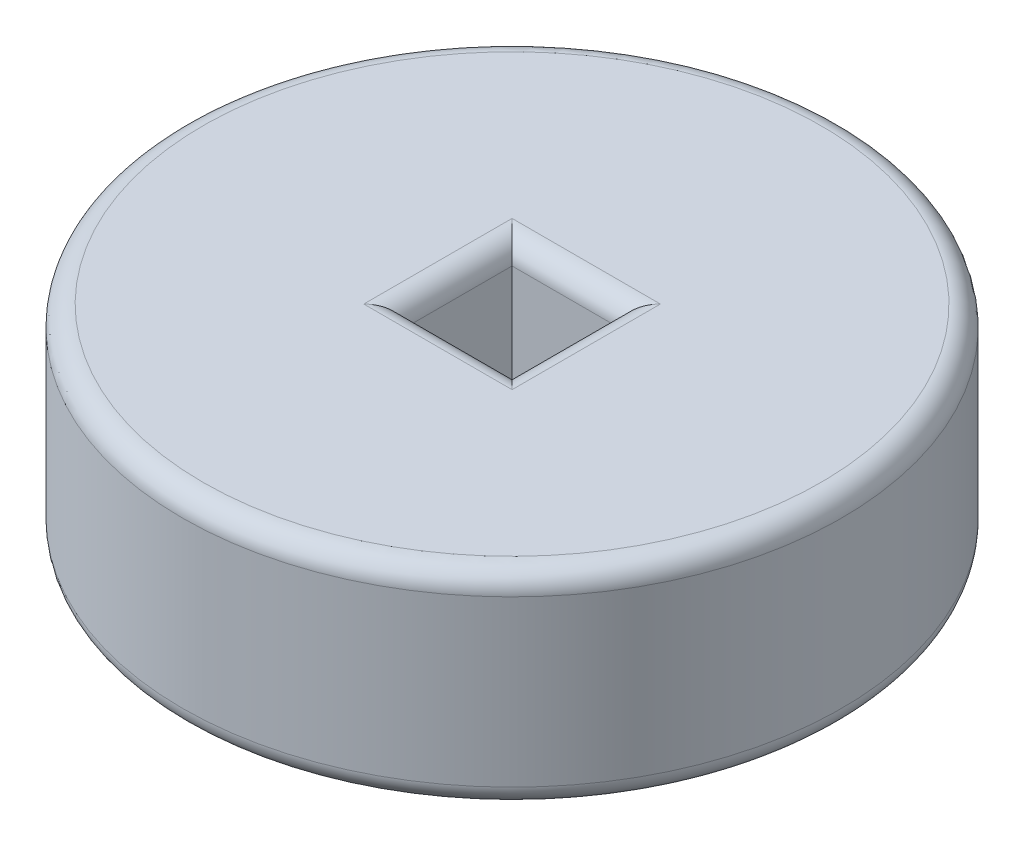
ISO-10303-21;
HEADER;
FILE_DESCRIPTION(('STEP AP214'),'2;1');
FILE_NAME('part.step','',(''),(''),'','','');
FILE_SCHEMA(('AUTOMOTIVE_DESIGN { 1 0 10303 214 1 1 1 1 }'));
ENDSEC;
DATA;
#1=APPLICATION_CONTEXT('core data for automotive mechanical design processes');
#2=APPLICATION_PROTOCOL_DEFINITION('international standard','automotive_design',2000,#1);
#3=PRODUCT_CONTEXT('',#1,'mechanical');
#4=PRODUCT('Part','Part','',(#3));
#5=PRODUCT_RELATED_PRODUCT_CATEGORY('part','',(#4));
#6=PRODUCT_DEFINITION_FORMATION('','',#4);
#7=PRODUCT_DEFINITION_CONTEXT('part definition',#1,'design');
#8=PRODUCT_DEFINITION('design','',#6,#7);
#9=PRODUCT_DEFINITION_SHAPE('','',#8);
#10=(LENGTH_UNIT() NAMED_UNIT(*) SI_UNIT(.MILLI.,.METRE.));
#11=(NAMED_UNIT(*) PLANE_ANGLE_UNIT() SI_UNIT($,.RADIAN.));
#12=(NAMED_UNIT(*) SI_UNIT($,.STERADIAN.) SOLID_ANGLE_UNIT());
#13=UNCERTAINTY_MEASURE_WITH_UNIT(LENGTH_MEASURE(1.E-05),#10,'distance_accuracy_value','');
#14=(GEOMETRIC_REPRESENTATION_CONTEXT(3) GLOBAL_UNCERTAINTY_ASSIGNED_CONTEXT((#13)) GLOBAL_UNIT_ASSIGNED_CONTEXT((#10,
#11,#12)) REPRESENTATION_CONTEXT('',''));
#15=CARTESIAN_POINT('',(0.,0.,0.));
#16=DIRECTION('',(0.,0.,1.));
#17=DIRECTION('',(1.,0.,0.));
#18=AXIS2_PLACEMENT_3D('',#15,#16,#17);
#19=CARTESIAN_POINT('',(0.,12.7,0.));
#20=DIRECTION('',(0.,1.,0.));
#21=DIRECTION('',(0.,0.,1.));
#22=AXIS2_PLACEMENT_3D('',#19,#20,#21);
#23=PLANE('',#22);
#24=DIRECTION('',(1.,0.,0.));
#25=VECTOR('',#24,1.);
#26=CARTESIAN_POINT('',(0.,12.7,4.572));
#27=LINE('',#26,#25);
#28=CARTESIAN_POINT('',(4.572,12.7,4.572));
#29=VERTEX_POINT('',#28);
#30=CARTESIAN_POINT('',(-4.572,12.7,4.572));
#31=VERTEX_POINT('',#30);
#32=EDGE_CURVE('E52',#29,#31,#27,.F.);
#33=ORIENTED_EDGE('',*,*,#32,.T.);
#34=DIRECTION('',(0.,0.,1.));
#35=VECTOR('',#34,1.);
#36=CARTESIAN_POINT('',(-4.572,12.7,0.));
#37=LINE('',#36,#35);
#38=CARTESIAN_POINT('',(-4.572,12.7,-4.572));
#39=VERTEX_POINT('',#38);
#40=EDGE_CURVE('E11',#31,#39,#37,.F.);
#41=ORIENTED_EDGE('',*,*,#40,.T.);
#42=DIRECTION('',(-1.,0.,0.));
#43=VECTOR('',#42,1.);
#44=CARTESIAN_POINT('',(0.,12.7,-4.572));
#45=LINE('',#44,#43);
#46=CARTESIAN_POINT('',(4.572,12.7,-4.572));
#47=VERTEX_POINT('',#46);
#48=EDGE_CURVE('E179',#39,#47,#45,.F.);
#49=ORIENTED_EDGE('',*,*,#48,.T.);
#50=DIRECTION('',(0.,0.,-1.));
#51=VECTOR('',#50,1.);
#52=CARTESIAN_POINT('',(4.572,12.7,0.));
#53=LINE('',#52,#51);
#54=EDGE_CURVE('E63',#47,#29,#53,.F.);
#55=ORIENTED_EDGE('',*,*,#54,.T.);
#56=EDGE_LOOP('',(#33,#41,#49,#55));
#57=FACE_BOUND('',#56,.T.);
#58=CARTESIAN_POINT('',(0.,12.7,0.));
#59=DIRECTION('',(0.,1.,0.));
#60=DIRECTION('',(0.,0.,1.));
#61=AXIS2_PLACEMENT_3D('',#58,#59,#60);
#62=CIRCLE('',#61,19.05);
#63=CARTESIAN_POINT('',(0.,12.7,19.05));
#64=VERTEX_POINT('',#63);
#65=EDGE_CURVE('E175',#64,#64,#62,.T.);
#66=ORIENTED_EDGE('',*,*,#65,.T.);
#67=EDGE_LOOP('',(#66));
#68=FACE_BOUND('',#67,.T.);
#69=ADVANCED_FACE('F42',(#57,#68),#23,.T.);
#70=CARTESIAN_POINT('',(0.,0.,0.));
#71=DIRECTION('',(0.,1.,0.));
#72=DIRECTION('',(0.,0.,1.));
#73=AXIS2_PLACEMENT_3D('',#70,#71,#72);
#74=PLANE('',#73);
#75=DIRECTION('',(0.,0.,1.));
#76=VECTOR('',#75,1.);
#77=CARTESIAN_POINT('',(-4.572,0.,3.302));
#78=LINE('',#77,#76);
#79=CARTESIAN_POINT('',(-4.572,0.,-4.572));
#80=VERTEX_POINT('',#79);
#81=CARTESIAN_POINT('',(-4.572,0.,4.572));
#82=VERTEX_POINT('',#81);
#83=EDGE_CURVE('E135',#80,#82,#78,.T.);
#84=ORIENTED_EDGE('',*,*,#83,.T.);
#85=DIRECTION('',(1.,0.,0.));
#86=VECTOR('',#85,1.);
#87=CARTESIAN_POINT('',(3.302,0.,4.572));
#88=LINE('',#87,#86);
#89=CARTESIAN_POINT('',(4.572,0.,4.572));
#90=VERTEX_POINT('',#89);
#91=EDGE_CURVE('E113',#82,#90,#88,.T.);
#92=ORIENTED_EDGE('',*,*,#91,.T.);
#93=DIRECTION('',(0.,0.,-1.));
#94=VECTOR('',#93,1.);
#95=CARTESIAN_POINT('',(4.572,0.,-3.302));
#96=LINE('',#95,#94);
#97=CARTESIAN_POINT('',(4.572,0.,-4.572));
#98=VERTEX_POINT('',#97);
#99=EDGE_CURVE('E122',#90,#98,#96,.T.);
#100=ORIENTED_EDGE('',*,*,#99,.T.);
#101=DIRECTION('',(-1.,0.,0.));
#102=VECTOR('',#101,1.);
#103=CARTESIAN_POINT('',(-3.302,0.,-4.572));
#104=LINE('',#103,#102);
#105=EDGE_CURVE('E129',#98,#80,#104,.T.);
#106=ORIENTED_EDGE('',*,*,#105,.T.);
#107=EDGE_LOOP('',(#84,#92,#100,#106));
#108=FACE_BOUND('',#107,.T.);
#109=CARTESIAN_POINT('',(0.,0.,0.));
#110=DIRECTION('',(0.,1.,0.));
#111=DIRECTION('',(0.,0.,1.));
#112=AXIS2_PLACEMENT_3D('',#109,#110,#111);
#113=CIRCLE('',#112,19.05);
#114=CARTESIAN_POINT('',(0.,0.,19.05));
#115=VERTEX_POINT('',#114);
#116=EDGE_CURVE('E130',#115,#115,#113,.F.);
#117=ORIENTED_EDGE('',*,*,#116,.T.);
#118=EDGE_LOOP('',(#117));
#119=FACE_BOUND('',#118,.T.);
#120=ADVANCED_FACE('F132',(#108,#119),#74,.F.);
#121=CARTESIAN_POINT('',(0.,12.7,0.));
#122=DIRECTION('',(0.,-1.,0.));
#123=DIRECTION('',(0.,0.,-1.));
#124=AXIS2_PLACEMENT_3D('',#121,#122,#123);
#125=CYLINDRICAL_SURFACE('',#124,20.32);
#126=CARTESIAN_POINT('',(0.,1.27,0.));
#127=DIRECTION('',(0.,1.,0.));
#128=DIRECTION('',(0.,0.,1.));
#129=AXIS2_PLACEMENT_3D('',#126,#127,#128);
#130=CIRCLE('',#129,20.32);
#131=CARTESIAN_POINT('',(0.,1.27,20.32));
#132=VERTEX_POINT('',#131);
#133=EDGE_CURVE('E171',#132,#132,#130,.T.);
#134=ORIENTED_EDGE('',*,*,#133,.T.);
#135=EDGE_LOOP('',(#134));
#136=FACE_BOUND('',#135,.T.);
#137=CARTESIAN_POINT('',(0.,11.43,0.));
#138=DIRECTION('',(0.,1.,0.));
#139=DIRECTION('',(0.,0.,1.));
#140=AXIS2_PLACEMENT_3D('',#137,#138,#139);
#141=CIRCLE('',#140,20.32);
#142=CARTESIAN_POINT('',(0.,11.43,20.32));
#143=VERTEX_POINT('',#142);
#144=EDGE_CURVE('E167',#143,#143,#141,.F.);
#145=ORIENTED_EDGE('',*,*,#144,.T.);
#146=EDGE_LOOP('',(#145));
#147=FACE_BOUND('',#146,.T.);
#148=ADVANCED_FACE('F234',(#136,#147),#125,.T.);
#149=CARTESIAN_POINT('',(3.302,12.7,3.302));
#150=DIRECTION('',(-1.,0.,0.));
#151=DIRECTION('',(0.,0.,1.));
#152=AXIS2_PLACEMENT_3D('',#149,#150,#151);
#153=PLANE('',#152);
#154=DIRECTION('',(0.,-1.,0.));
#155=VECTOR('',#154,1.);
#156=CARTESIAN_POINT('',(3.302,12.7,-3.302));
#157=LINE('',#156,#155);
#158=CARTESIAN_POINT('',(3.302,11.43,-3.302));
#159=VERTEX_POINT('',#158);
#160=CARTESIAN_POINT('',(3.302,1.27,-3.302));
#161=VERTEX_POINT('',#160);
#162=EDGE_CURVE('E418',#159,#161,#157,.T.);
#163=ORIENTED_EDGE('',*,*,#162,.T.);
#164=DIRECTION('',(0.,0.,-1.));
#165=VECTOR('',#164,1.);
#166=CARTESIAN_POINT('',(3.302,1.27,3.302));
#167=LINE('',#166,#165);
#168=CARTESIAN_POINT('',(3.302,1.27,3.302));
#169=VERTEX_POINT('',#168);
#170=EDGE_CURVE('E164',#161,#169,#167,.F.);
#171=ORIENTED_EDGE('',*,*,#170,.T.);
#172=DIRECTION('',(0.,-1.,0.));
#173=VECTOR('',#172,1.);
#174=CARTESIAN_POINT('',(3.302,12.7,3.302));
#175=LINE('',#174,#173);
#176=CARTESIAN_POINT('',(3.302,11.43,3.302));
#177=VERTEX_POINT('',#176);
#178=EDGE_CURVE('E194',#177,#169,#175,.T.);
#179=ORIENTED_EDGE('',*,*,#178,.F.);
#180=DIRECTION('',(0.,0.,-1.));
#181=VECTOR('',#180,1.);
#182=CARTESIAN_POINT('',(3.302,11.43,3.302));
#183=LINE('',#182,#181);
#184=EDGE_CURVE('E161',#177,#159,#183,.T.);
#185=ORIENTED_EDGE('',*,*,#184,.T.);
#186=EDGE_LOOP('',(#163,#171,#179,#185));
#187=FACE_BOUND('',#186,.T.);
#188=ADVANCED_FACE('F236',(#187),#153,.T.);
#189=CARTESIAN_POINT('',(-3.302,12.7,-3.302));
#190=DIRECTION('',(0.,0.,1.));
#191=DIRECTION('',(1.,0.,0.));
#192=AXIS2_PLACEMENT_3D('',#189,#190,#191);
#193=PLANE('',#192);
#194=DIRECTION('',(0.,-1.,0.));
#195=VECTOR('',#194,1.);
#196=CARTESIAN_POINT('',(-3.302,12.7,-3.302));
#197=LINE('',#196,#195);
#198=CARTESIAN_POINT('',(-3.302,11.43,-3.302));
#199=VERTEX_POINT('',#198);
#200=CARTESIAN_POINT('',(-3.302,1.27,-3.302));
#201=VERTEX_POINT('',#200);
#202=EDGE_CURVE('E413',#199,#201,#197,.T.);
#203=ORIENTED_EDGE('',*,*,#202,.T.);
#204=DIRECTION('',(-1.,0.,0.));
#205=VECTOR('',#204,1.);
#206=CARTESIAN_POINT('',(3.302,1.27,-3.302));
#207=LINE('',#206,#205);
#208=EDGE_CURVE('E158',#201,#161,#207,.F.);
#209=ORIENTED_EDGE('',*,*,#208,.T.);
#210=ORIENTED_EDGE('',*,*,#162,.F.);
#211=DIRECTION('',(-1.,0.,0.));
#212=VECTOR('',#211,1.);
#213=CARTESIAN_POINT('',(-3.302,11.43,-3.302));
#214=LINE('',#213,#212);
#215=EDGE_CURVE('E155',#159,#199,#214,.T.);
#216=ORIENTED_EDGE('',*,*,#215,.T.);
#217=EDGE_LOOP('',(#203,#209,#210,#216));
#218=FACE_BOUND('',#217,.T.);
#219=ADVANCED_FACE('F243',(#218),#193,.T.);
#220=CARTESIAN_POINT('',(-3.302,12.7,3.302));
#221=DIRECTION('',(1.,0.,0.));
#222=DIRECTION('',(0.,0.,-1.));
#223=AXIS2_PLACEMENT_3D('',#220,#221,#222);
#224=PLANE('',#223);
#225=DIRECTION('',(0.,-1.,0.));
#226=VECTOR('',#225,1.);
#227=CARTESIAN_POINT('',(-3.302,12.7,3.302));
#228=LINE('',#227,#226);
#229=CARTESIAN_POINT('',(-3.302,11.43,3.302));
#230=VERTEX_POINT('',#229);
#231=CARTESIAN_POINT('',(-3.302,1.27,3.302));
#232=VERTEX_POINT('',#231);
#233=EDGE_CURVE('E419',#230,#232,#228,.T.);
#234=ORIENTED_EDGE('',*,*,#233,.T.);
#235=DIRECTION('',(0.,0.,1.));
#236=VECTOR('',#235,1.);
#237=CARTESIAN_POINT('',(-3.302,1.27,-3.302));
#238=LINE('',#237,#236);
#239=EDGE_CURVE('E152',#232,#201,#238,.F.);
#240=ORIENTED_EDGE('',*,*,#239,.T.);
#241=ORIENTED_EDGE('',*,*,#202,.F.);
#242=DIRECTION('',(0.,0.,1.));
#243=VECTOR('',#242,1.);
#244=CARTESIAN_POINT('',(-3.302,11.43,3.302));
#245=LINE('',#244,#243);
#246=EDGE_CURVE('E148',#199,#230,#245,.T.);
#247=ORIENTED_EDGE('',*,*,#246,.T.);
#248=EDGE_LOOP('',(#234,#240,#241,#247));
#249=FACE_BOUND('',#248,.T.);
#250=ADVANCED_FACE('F343',(#249),#224,.T.);
#251=CARTESIAN_POINT('',(-3.302,12.7,3.302));
#252=DIRECTION('',(0.,0.,-1.));
#253=DIRECTION('',(-1.,0.,0.));
#254=AXIS2_PLACEMENT_3D('',#251,#252,#253);
#255=PLANE('',#254);
#256=ORIENTED_EDGE('',*,*,#178,.T.);
#257=DIRECTION('',(1.,0.,0.));
#258=VECTOR('',#257,1.);
#259=CARTESIAN_POINT('',(-3.302,1.27,3.302));
#260=LINE('',#259,#258);
#261=EDGE_CURVE('E115',#169,#232,#260,.F.);
#262=ORIENTED_EDGE('',*,*,#261,.T.);
#263=ORIENTED_EDGE('',*,*,#233,.F.);
#264=DIRECTION('',(1.,0.,0.));
#265=VECTOR('',#264,1.);
#266=CARTESIAN_POINT('',(-3.302,11.43,3.302));
#267=LINE('',#266,#265);
#268=EDGE_CURVE('E138',#230,#177,#267,.T.);
#269=ORIENTED_EDGE('',*,*,#268,.T.);
#270=EDGE_LOOP('',(#256,#262,#263,#269));
#271=FACE_BOUND('',#270,.T.);
#272=ADVANCED_FACE('F260',(#271),#255,.T.);
#273=CARTESIAN_POINT('',(0.,1.27,-4.572));
#274=DIRECTION('',(1.,0.,0.));
#275=DIRECTION('',(0.,0.,-1.));
#276=AXIS2_PLACEMENT_3D('',#273,#274,#275);
#277=CYLINDRICAL_SURFACE('',#276,1.27);
#278=CARTESIAN_POINT('',(4.572,1.27,-4.572));
#279=DIRECTION('',(0.707106781186547,0.,0.707106781186547));
#280=DIRECTION('',(0.707106781186547,0.,-0.707106781186547));
#281=AXIS2_PLACEMENT_3D('',#278,#279,#280);
#282=ELLIPSE('',#281,1.79605122421383,1.27);
#283=EDGE_CURVE('E125',#161,#98,#282,.T.);
#284=ORIENTED_EDGE('',*,*,#283,.F.);
#285=ORIENTED_EDGE('',*,*,#208,.F.);
#286=CARTESIAN_POINT('',(-4.572,1.27,-4.572));
#287=DIRECTION('',(0.707106781186547,0.,-0.707106781186547));
#288=DIRECTION('',(-0.707106781186547,0.,-0.707106781186547));
#289=AXIS2_PLACEMENT_3D('',#286,#287,#288);
#290=ELLIPSE('',#289,1.79605122421383,1.27);
#291=EDGE_CURVE('E190',#80,#201,#290,.F.);
#292=ORIENTED_EDGE('',*,*,#291,.F.);
#293=ORIENTED_EDGE('',*,*,#105,.F.);
#294=EDGE_LOOP('',(#284,#285,#292,#293));
#295=FACE_BOUND('',#294,.T.);
#296=ADVANCED_FACE('F256',(#295),#277,.T.);
#297=CARTESIAN_POINT('',(-4.572,1.27,0.));
#298=DIRECTION('',(0.,0.,-1.));
#299=DIRECTION('',(-1.,0.,0.));
#300=AXIS2_PLACEMENT_3D('',#297,#298,#299);
#301=CYLINDRICAL_SURFACE('',#300,1.27);
#302=ORIENTED_EDGE('',*,*,#291,.T.);
#303=ORIENTED_EDGE('',*,*,#239,.F.);
#304=CARTESIAN_POINT('',(-4.572,1.27,4.572));
#305=DIRECTION('',(-0.707106781186547,0.,-0.707106781186547));
#306=DIRECTION('',(-0.707106781186547,0.,0.707106781186547));
#307=AXIS2_PLACEMENT_3D('',#304,#305,#306);
#308=ELLIPSE('',#307,1.79605122421383,1.27);
#309=EDGE_CURVE('E119',#82,#232,#308,.F.);
#310=ORIENTED_EDGE('',*,*,#309,.F.);
#311=ORIENTED_EDGE('',*,*,#83,.F.);
#312=EDGE_LOOP('',(#302,#303,#310,#311));
#313=FACE_BOUND('',#312,.T.);
#314=ADVANCED_FACE('F253',(#313),#301,.T.);
#315=CARTESIAN_POINT('',(4.572,1.27,0.));
#316=DIRECTION('',(0.,0.,1.));
#317=DIRECTION('',(1.,0.,0.));
#318=AXIS2_PLACEMENT_3D('',#315,#316,#317);
#319=CYLINDRICAL_SURFACE('',#318,1.27);
#320=ORIENTED_EDGE('',*,*,#283,.T.);
#321=ORIENTED_EDGE('',*,*,#99,.F.);
#322=CARTESIAN_POINT('',(4.572,1.27,4.572));
#323=DIRECTION('',(-0.707106781186547,0.,0.707106781186547));
#324=DIRECTION('',(-0.707106781186547,0.,-0.707106781186547));
#325=AXIS2_PLACEMENT_3D('',#322,#323,#324);
#326=ELLIPSE('',#325,1.79605122421383,1.27);
#327=EDGE_CURVE('E109',#169,#90,#326,.T.);
#328=ORIENTED_EDGE('',*,*,#327,.F.);
#329=ORIENTED_EDGE('',*,*,#170,.F.);
#330=EDGE_LOOP('',(#320,#321,#328,#329));
#331=FACE_BOUND('',#330,.T.);
#332=ADVANCED_FACE('F123',(#331),#319,.T.);
#333=CARTESIAN_POINT('',(0.,1.27,4.572));
#334=DIRECTION('',(-1.,0.,0.));
#335=DIRECTION('',(0.,0.,1.));
#336=AXIS2_PLACEMENT_3D('',#333,#334,#335);
#337=CYLINDRICAL_SURFACE('',#336,1.27);
#338=ORIENTED_EDGE('',*,*,#309,.T.);
#339=ORIENTED_EDGE('',*,*,#261,.F.);
#340=ORIENTED_EDGE('',*,*,#327,.T.);
#341=ORIENTED_EDGE('',*,*,#91,.F.);
#342=EDGE_LOOP('',(#338,#339,#340,#341));
#343=FACE_BOUND('',#342,.T.);
#344=ADVANCED_FACE('F111',(#343),#337,.T.);
#345=CARTESIAN_POINT('',(0.,1.27,0.));
#346=DIRECTION('',(0.,1.,0.));
#347=DIRECTION('',(0.,0.,1.));
#348=AXIS2_PLACEMENT_3D('',#345,#346,#347);
#349=TOROIDAL_SURFACE('',#348,19.05,1.27);
#350=ORIENTED_EDGE('',*,*,#116,.F.);
#351=EDGE_LOOP('',(#350));
#352=FACE_BOUND('',#351,.T.);
#353=ORIENTED_EDGE('',*,*,#133,.F.);
#354=EDGE_LOOP('',(#353));
#355=FACE_BOUND('',#354,.T.);
#356=ADVANCED_FACE('F250',(#352,#355),#349,.T.);
#357=CARTESIAN_POINT('',(4.572,11.43,3.302));
#358=DIRECTION('',(0.,0.,-1.));
#359=DIRECTION('',(-1.,0.,0.));
#360=AXIS2_PLACEMENT_3D('',#357,#358,#359);
#361=CYLINDRICAL_SURFACE('',#360,1.27);
#362=CARTESIAN_POINT('',(4.572,11.43,4.572));
#363=DIRECTION('',(0.707106781186547,0.,-0.707106781186547));
#364=DIRECTION('',(0.707106781186547,0.,0.707106781186547));
#365=AXIS2_PLACEMENT_3D('',#362,#363,#364);
#366=ELLIPSE('',#365,1.79605122421383,1.27);
#367=EDGE_CURVE('E200',#29,#177,#366,.F.);
#368=ORIENTED_EDGE('',*,*,#367,.F.);
#369=ORIENTED_EDGE('',*,*,#54,.F.);
#370=CARTESIAN_POINT('',(4.572,11.43,-4.572));
#371=DIRECTION('',(-0.707106781186547,0.,-0.707106781186547));
#372=DIRECTION('',(0.707106781186547,0.,-0.707106781186547));
#373=AXIS2_PLACEMENT_3D('',#370,#371,#372);
#374=ELLIPSE('',#373,1.79605122421383,1.27);
#375=EDGE_CURVE('E46',#159,#47,#374,.T.);
#376=ORIENTED_EDGE('',*,*,#375,.F.);
#377=ORIENTED_EDGE('',*,*,#184,.F.);
#378=EDGE_LOOP('',(#368,#369,#376,#377));
#379=FACE_BOUND('',#378,.T.);
#380=ADVANCED_FACE('F215',(#379),#361,.T.);
#381=CARTESIAN_POINT('',(-3.302,11.43,-4.572));
#382=DIRECTION('',(-1.,0.,0.));
#383=DIRECTION('',(0.,0.,1.));
#384=AXIS2_PLACEMENT_3D('',#381,#382,#383);
#385=CYLINDRICAL_SURFACE('',#384,1.27);
#386=ORIENTED_EDGE('',*,*,#375,.T.);
#387=ORIENTED_EDGE('',*,*,#48,.F.);
#388=CARTESIAN_POINT('',(-4.572,11.43,-4.572));
#389=DIRECTION('',(-0.707106781186547,0.,0.707106781186547));
#390=DIRECTION('',(0.707106781186547,0.,0.707106781186547));
#391=AXIS2_PLACEMENT_3D('',#388,#389,#390);
#392=ELLIPSE('',#391,1.79605122421383,1.27);
#393=EDGE_CURVE('E198',#199,#39,#392,.T.);
#394=ORIENTED_EDGE('',*,*,#393,.F.);
#395=ORIENTED_EDGE('',*,*,#215,.F.);
#396=EDGE_LOOP('',(#386,#387,#394,#395));
#397=FACE_BOUND('',#396,.T.);
#398=ADVANCED_FACE('F211',(#397),#385,.T.);
#399=CARTESIAN_POINT('',(-3.302,11.43,4.572));
#400=DIRECTION('',(1.,0.,0.));
#401=DIRECTION('',(0.,0.,-1.));
#402=AXIS2_PLACEMENT_3D('',#399,#400,#401);
#403=CYLINDRICAL_SURFACE('',#402,1.27);
#404=ORIENTED_EDGE('',*,*,#367,.T.);
#405=ORIENTED_EDGE('',*,*,#268,.F.);
#406=CARTESIAN_POINT('',(-4.572,11.43,4.572));
#407=DIRECTION('',(0.707106781186547,0.,0.707106781186547));
#408=DIRECTION('',(-0.707106781186547,0.,0.707106781186547));
#409=AXIS2_PLACEMENT_3D('',#406,#407,#408);
#410=ELLIPSE('',#409,1.79605122421383,1.27);
#411=EDGE_CURVE('E195',#31,#230,#410,.F.);
#412=ORIENTED_EDGE('',*,*,#411,.F.);
#413=ORIENTED_EDGE('',*,*,#32,.F.);
#414=EDGE_LOOP('',(#404,#405,#412,#413));
#415=FACE_BOUND('',#414,.T.);
#416=ADVANCED_FACE('F217',(#415),#403,.T.);
#417=CARTESIAN_POINT('',(-4.572,11.43,3.302));
#418=DIRECTION('',(0.,0.,1.));
#419=DIRECTION('',(1.,0.,0.));
#420=AXIS2_PLACEMENT_3D('',#417,#418,#419);
#421=CYLINDRICAL_SURFACE('',#420,1.27);
#422=ORIENTED_EDGE('',*,*,#393,.T.);
#423=ORIENTED_EDGE('',*,*,#40,.F.);
#424=ORIENTED_EDGE('',*,*,#411,.T.);
#425=ORIENTED_EDGE('',*,*,#246,.F.);
#426=EDGE_LOOP('',(#422,#423,#424,#425));
#427=FACE_BOUND('',#426,.T.);
#428=ADVANCED_FACE('F220',(#427),#421,.T.);
#429=CARTESIAN_POINT('',(0.,11.43,0.));
#430=DIRECTION('',(0.,1.,0.));
#431=DIRECTION('',(0.,0.,1.));
#432=AXIS2_PLACEMENT_3D('',#429,#430,#431);
#433=TOROIDAL_SURFACE('',#432,19.05,1.27);
#434=ORIENTED_EDGE('',*,*,#144,.F.);
#435=EDGE_LOOP('',(#434));
#436=FACE_BOUND('',#435,.T.);
#437=ORIENTED_EDGE('',*,*,#65,.F.);
#438=EDGE_LOOP('',(#437));
#439=FACE_BOUND('',#438,.T.);
#440=ADVANCED_FACE('F44',(#436,#439),#433,.T.);
#441=CLOSED_SHELL('',(#69,#120,#148,#188,#219,#250,#272,#296,#314,#332,#344,#356,#380,#398,#416,
#428,#440));
#442=MANIFOLD_SOLID_BREP('B2',#441);
#443=ADVANCED_BREP_SHAPE_REPRESENTATION('',(#18,#442),#14);
#444=SHAPE_DEFINITION_REPRESENTATION(#9,#443);
ENDSEC;
END-ISO-10303-21;
